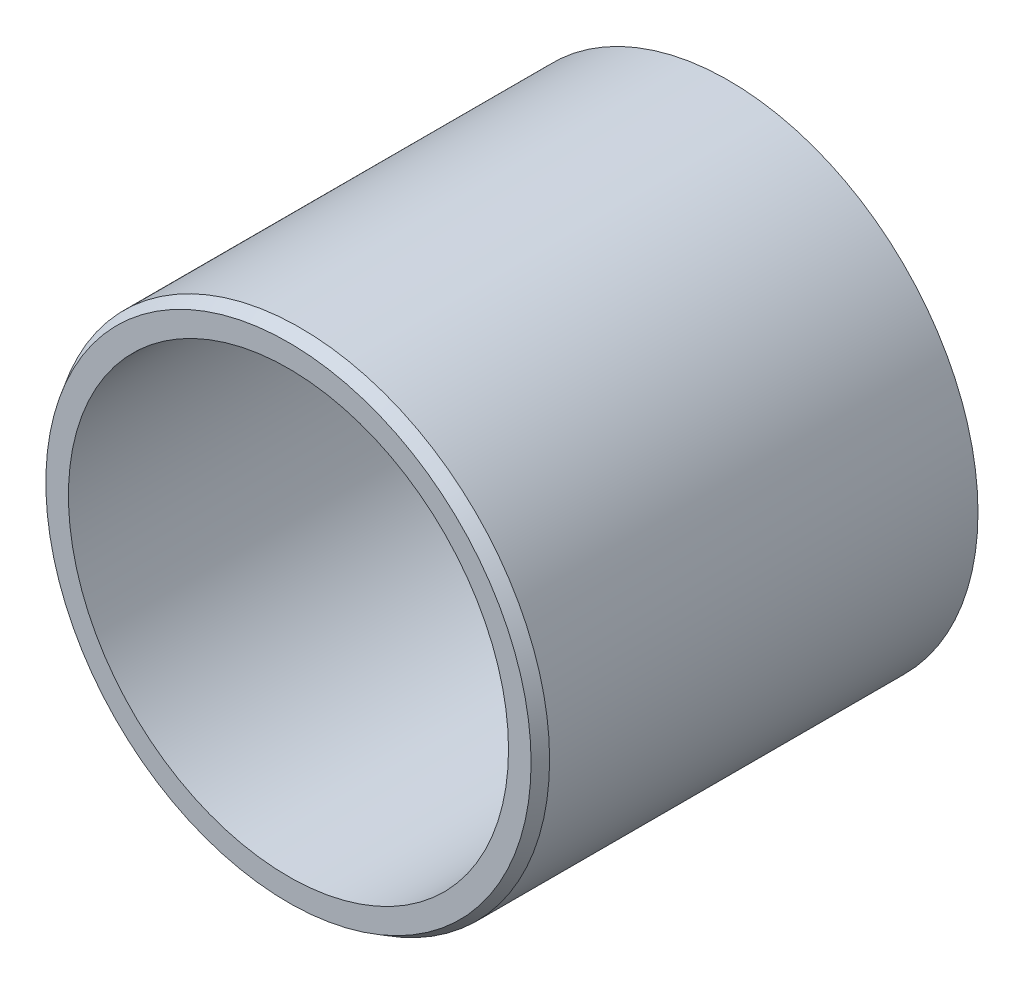
ISO-10303-21;
HEADER;
FILE_DESCRIPTION(('STEP AP214'),'2;1');
FILE_NAME('part.step','',(''),(''),'','','');
FILE_SCHEMA(('AUTOMOTIVE_DESIGN { 1 0 10303 214 1 1 1 1 }'));
ENDSEC;
DATA;
#1=APPLICATION_CONTEXT('core data for automotive mechanical design processes');
#2=APPLICATION_PROTOCOL_DEFINITION('international standard','automotive_design',2000,#1);
#3=PRODUCT_CONTEXT('',#1,'mechanical');
#4=PRODUCT('Part','Part','',(#3));
#5=PRODUCT_RELATED_PRODUCT_CATEGORY('part','',(#4));
#6=PRODUCT_DEFINITION_FORMATION('','',#4);
#7=PRODUCT_DEFINITION_CONTEXT('part definition',#1,'design');
#8=PRODUCT_DEFINITION('design','',#6,#7);
#9=PRODUCT_DEFINITION_SHAPE('','',#8);
#10=(LENGTH_UNIT() NAMED_UNIT(*) SI_UNIT(.MILLI.,.METRE.));
#11=(NAMED_UNIT(*) PLANE_ANGLE_UNIT() SI_UNIT($,.RADIAN.));
#12=(NAMED_UNIT(*) SI_UNIT($,.STERADIAN.) SOLID_ANGLE_UNIT());
#13=UNCERTAINTY_MEASURE_WITH_UNIT(LENGTH_MEASURE(1.E-05),#10,'distance_accuracy_value','');
#14=(GEOMETRIC_REPRESENTATION_CONTEXT(3) GLOBAL_UNCERTAINTY_ASSIGNED_CONTEXT((#13)) GLOBAL_UNIT_ASSIGNED_CONTEXT((#10,
#11,#12)) REPRESENTATION_CONTEXT('',''));
#15=CARTESIAN_POINT('',(0.,0.,0.));
#16=DIRECTION('',(0.,0.,1.));
#17=DIRECTION('',(1.,0.,0.));
#18=AXIS2_PLACEMENT_3D('',#15,#16,#17);
#19=CARTESIAN_POINT('',(0.,0.,14.2));
#20=DIRECTION('',(0.,0.,-1.));
#21=DIRECTION('',(-1.,0.,0.));
#22=AXIS2_PLACEMENT_3D('',#19,#20,#21);
#23=CONICAL_SURFACE('',#22,17.,0.523598775598299);
#24=CARTESIAN_POINT('',(0.,0.,15.));
#25=DIRECTION('',(0.,0.,1.));
#26=DIRECTION('',(1.,0.,0.));
#27=AXIS2_PLACEMENT_3D('',#24,#25,#26);
#28=CIRCLE('',#27,16.5381197846483);
#29=CARTESIAN_POINT('',(16.5381197846483,0.,15.));
#30=VERTEX_POINT('',#29);
#31=EDGE_CURVE('E68',#30,#30,#28,.T.);
#32=ORIENTED_EDGE('',*,*,#31,.F.);
#33=EDGE_LOOP('',(#32));
#34=FACE_BOUND('',#33,.T.);
#35=CARTESIAN_POINT('',(0.,0.,14.2));
#36=DIRECTION('',(0.,0.,1.));
#37=DIRECTION('',(1.,0.,0.));
#38=AXIS2_PLACEMENT_3D('',#35,#36,#37);
#39=CIRCLE('',#38,17.);
#40=CARTESIAN_POINT('',(17.,0.,14.2));
#41=VERTEX_POINT('',#40);
#42=EDGE_CURVE('E10',#41,#41,#39,.T.);
#43=ORIENTED_EDGE('',*,*,#42,.T.);
#44=EDGE_LOOP('',(#43));
#45=FACE_BOUND('',#44,.T.);
#46=ADVANCED_FACE('F43',(#34,#45),#23,.T.);
#47=CARTESIAN_POINT('',(0.,0.,16.2650693207624));
#48=DIRECTION('',(0.,0.,1.));
#49=DIRECTION('',(1.,0.,0.));
#50=AXIS2_PLACEMENT_3D('',#47,#48,#49);
#51=CYLINDRICAL_SURFACE('',#50,17.);
#52=ORIENTED_EDGE('',*,*,#42,.F.);
#53=EDGE_LOOP('',(#52));
#54=FACE_BOUND('',#53,.T.);
#55=CARTESIAN_POINT('',(0.,0.,-15.));
#56=DIRECTION('',(0.,0.,1.));
#57=DIRECTION('',(1.,0.,0.));
#58=AXIS2_PLACEMENT_3D('',#55,#56,#57);
#59=CIRCLE('',#58,17.);
#60=CARTESIAN_POINT('',(17.,0.,-15.));
#61=VERTEX_POINT('',#60);
#62=EDGE_CURVE('E50',#61,#61,#59,.T.);
#63=ORIENTED_EDGE('',*,*,#62,.T.);
#64=EDGE_LOOP('',(#63));
#65=FACE_BOUND('',#64,.T.);
#66=ADVANCED_FACE('F76',(#54,#65),#51,.T.);
#67=CARTESIAN_POINT('',(0.,17.,-15.));
#68=DIRECTION('',(0.,0.,1.));
#69=DIRECTION('',(1.,0.,0.));
#70=AXIS2_PLACEMENT_3D('',#67,#68,#69);
#71=PLANE('',#70);
#72=ORIENTED_EDGE('',*,*,#62,.F.);
#73=EDGE_LOOP('',(#72));
#74=FACE_BOUND('',#73,.T.);
#75=CARTESIAN_POINT('',(0.,0.,-15.));
#76=DIRECTION('',(0.,0.,1.));
#77=DIRECTION('',(1.,0.,0.));
#78=AXIS2_PLACEMENT_3D('',#75,#76,#77);
#79=CIRCLE('',#78,15.1339745962156);
#80=CARTESIAN_POINT('',(15.1339745962156,0.,-15.));
#81=VERTEX_POINT('',#80);
#82=EDGE_CURVE('E54',#81,#81,#79,.T.);
#83=ORIENTED_EDGE('',*,*,#82,.T.);
#84=EDGE_LOOP('',(#83));
#85=FACE_BOUND('',#84,.T.);
#86=ADVANCED_FACE('F80',(#74,#85),#71,.F.);
#87=CARTESIAN_POINT('',(0.,0.,-14.5));
#88=DIRECTION('',(0.,0.,-1.));
#89=DIRECTION('',(-1.,0.,0.));
#90=AXIS2_PLACEMENT_3D('',#87,#88,#89);
#91=CONICAL_SURFACE('',#90,15.,0.261799387799148);
#92=ORIENTED_EDGE('',*,*,#82,.F.);
#93=EDGE_LOOP('',(#92));
#94=FACE_BOUND('',#93,.T.);
#95=CARTESIAN_POINT('',(0.,0.,-14.5));
#96=DIRECTION('',(0.,0.,1.));
#97=DIRECTION('',(1.,0.,0.));
#98=AXIS2_PLACEMENT_3D('',#95,#96,#97);
#99=CIRCLE('',#98,15.);
#100=CARTESIAN_POINT('',(15.,0.,-14.5));
#101=VERTEX_POINT('',#100);
#102=EDGE_CURVE('E58',#101,#101,#99,.T.);
#103=ORIENTED_EDGE('',*,*,#102,.T.);
#104=EDGE_LOOP('',(#103));
#105=FACE_BOUND('',#104,.T.);
#106=ADVANCED_FACE('F85',(#94,#105),#91,.F.);
#107=CARTESIAN_POINT('',(0.,0.,16.2650693207624));
#108=DIRECTION('',(0.,0.,1.));
#109=DIRECTION('',(1.,0.,0.));
#110=AXIS2_PLACEMENT_3D('',#107,#108,#109);
#111=CYLINDRICAL_SURFACE('',#110,15.);
#112=ORIENTED_EDGE('',*,*,#102,.F.);
#113=EDGE_LOOP('',(#112));
#114=FACE_BOUND('',#113,.T.);
#115=CARTESIAN_POINT('',(0.,0.,15.));
#116=DIRECTION('',(0.,0.,1.));
#117=DIRECTION('',(1.,0.,0.));
#118=AXIS2_PLACEMENT_3D('',#115,#116,#117);
#119=CIRCLE('',#118,15.);
#120=CARTESIAN_POINT('',(15.,0.,15.));
#121=VERTEX_POINT('',#120);
#122=EDGE_CURVE('E64',#121,#121,#119,.T.);
#123=ORIENTED_EDGE('',*,*,#122,.T.);
#124=EDGE_LOOP('',(#123));
#125=FACE_BOUND('',#124,.T.);
#126=ADVANCED_FACE('F91',(#114,#125),#111,.F.);
#127=CARTESIAN_POINT('',(0.,16.5381197846483,15.));
#128=DIRECTION('',(0.,0.,-1.));
#129=DIRECTION('',(-1.,0.,0.));
#130=AXIS2_PLACEMENT_3D('',#127,#128,#129);
#131=PLANE('',#130);
#132=ORIENTED_EDGE('',*,*,#122,.F.);
#133=EDGE_LOOP('',(#132));
#134=FACE_BOUND('',#133,.T.);
#135=ORIENTED_EDGE('',*,*,#31,.T.);
#136=EDGE_LOOP('',(#135));
#137=FACE_BOUND('',#136,.T.);
#138=ADVANCED_FACE('F73',(#134,#137),#131,.F.);
#139=CLOSED_SHELL('',(#46,#66,#86,#106,#126,#138));
#140=MANIFOLD_SOLID_BREP('B2',#139);
#141=ADVANCED_BREP_SHAPE_REPRESENTATION('',(#18,#140),#14);
#142=SHAPE_DEFINITION_REPRESENTATION(#9,#141);
ENDSEC;
END-ISO-10303-21;
